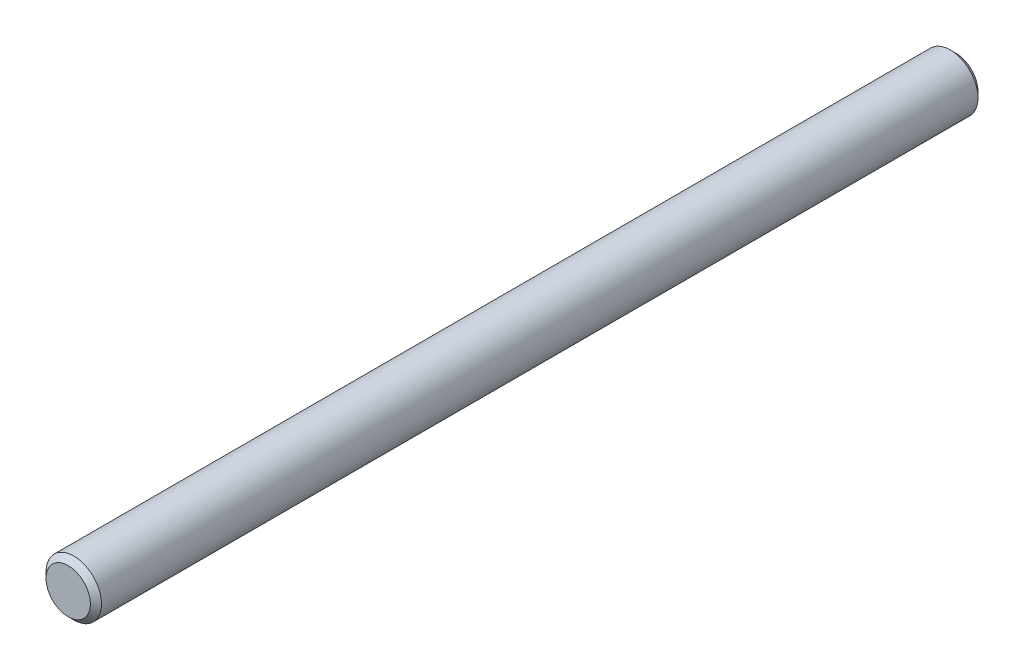
ISO-10303-21;
HEADER;
FILE_DESCRIPTION(('STEP AP214'),'2;1');
FILE_NAME('part.step','',(''),(''),'','','');
FILE_SCHEMA(('AUTOMOTIVE_DESIGN { 1 0 10303 214 1 1 1 1 }'));
ENDSEC;
DATA;
#1=APPLICATION_CONTEXT('core data for automotive mechanical design processes');
#2=APPLICATION_PROTOCOL_DEFINITION('international standard','automotive_design',2000,#1);
#3=PRODUCT_CONTEXT('',#1,'mechanical');
#4=PRODUCT('Part','Part','',(#3));
#5=PRODUCT_RELATED_PRODUCT_CATEGORY('part','',(#4));
#6=PRODUCT_DEFINITION_FORMATION('','',#4);
#7=PRODUCT_DEFINITION_CONTEXT('part definition',#1,'design');
#8=PRODUCT_DEFINITION('design','',#6,#7);
#9=PRODUCT_DEFINITION_SHAPE('','',#8);
#10=(LENGTH_UNIT() NAMED_UNIT(*) SI_UNIT(.MILLI.,.METRE.));
#11=(NAMED_UNIT(*) PLANE_ANGLE_UNIT() SI_UNIT($,.RADIAN.));
#12=(NAMED_UNIT(*) SI_UNIT($,.STERADIAN.) SOLID_ANGLE_UNIT());
#13=UNCERTAINTY_MEASURE_WITH_UNIT(LENGTH_MEASURE(1.E-05),#10,'distance_accuracy_value','');
#14=(GEOMETRIC_REPRESENTATION_CONTEXT(3) GLOBAL_UNCERTAINTY_ASSIGNED_CONTEXT((#13)) GLOBAL_UNIT_ASSIGNED_CONTEXT((#10,
#11,#12)) REPRESENTATION_CONTEXT('',''));
#15=CARTESIAN_POINT('',(0.,0.,0.));
#16=DIRECTION('',(0.,0.,1.));
#17=DIRECTION('',(1.,0.,0.));
#18=AXIS2_PLACEMENT_3D('',#15,#16,#17);
#19=CARTESIAN_POINT('',(0.,0.,-19.5000000000095));
#20=DIRECTION('',(0.,0.,1.));
#21=DIRECTION('',(1.,0.,0.));
#22=AXIS2_PLACEMENT_3D('',#19,#20,#21);
#23=CONICAL_SURFACE('',#22,2.5000000000273,0.785398163397448);
#24=CARTESIAN_POINT('',(0.,0.,-20.));
#25=DIRECTION('',(0.,0.,1.));
#26=DIRECTION('',(1.,0.,0.));
#27=AXIS2_PLACEMENT_3D('',#24,#25,#26);
#28=CIRCLE('',#27,2.00000000003684);
#29=CARTESIAN_POINT('',(2.00000000003683,0.,-20.));
#30=VERTEX_POINT('',#29);
#31=EDGE_CURVE('E52',#30,#30,#28,.T.);
#32=ORIENTED_EDGE('',*,*,#31,.T.);
#33=EDGE_LOOP('',(#32));
#34=FACE_BOUND('',#33,.T.);
#35=CARTESIAN_POINT('',(0.,0.,-19.5000000000095));
#36=DIRECTION('',(0.,0.,1.));
#37=DIRECTION('',(1.,0.,0.));
#38=AXIS2_PLACEMENT_3D('',#35,#36,#37);
#39=CIRCLE('',#38,2.5000000000273);
#40=CARTESIAN_POINT('',(2.50000000002729,0.,-19.5000000000095));
#41=VERTEX_POINT('',#40);
#42=EDGE_CURVE('E10',#41,#41,#39,.T.);
#43=ORIENTED_EDGE('',*,*,#42,.F.);
#44=EDGE_LOOP('',(#43));
#45=FACE_BOUND('',#44,.T.);
#46=ADVANCED_FACE('F34',(#34,#45),#23,.T.);
#47=CARTESIAN_POINT('',(0.,0.,-20.));
#48=DIRECTION('',(0.,0.,1.));
#49=DIRECTION('',(1.,0.,0.));
#50=AXIS2_PLACEMENT_3D('',#47,#48,#49);
#51=CYLINDRICAL_SURFACE('',#50,2.50000000002729);
#52=ORIENTED_EDGE('',*,*,#42,.T.);
#53=EDGE_LOOP('',(#52));
#54=FACE_BOUND('',#53,.T.);
#55=CARTESIAN_POINT('',(0.,0.,59.5000000000391));
#56=DIRECTION('',(0.,0.,1.));
#57=DIRECTION('',(1.,0.,0.));
#58=AXIS2_PLACEMENT_3D('',#55,#56,#57);
#59=CIRCLE('',#58,2.50000000002729);
#60=CARTESIAN_POINT('',(2.50000000002729,0.,59.5000000000391));
#61=VERTEX_POINT('',#60);
#62=EDGE_CURVE('E41',#61,#61,#59,.T.);
#63=ORIENTED_EDGE('',*,*,#62,.F.);
#64=EDGE_LOOP('',(#63));
#65=FACE_BOUND('',#64,.T.);
#66=ADVANCED_FACE('F71',(#54,#65),#51,.T.);
#67=CARTESIAN_POINT('',(0.,0.,60.));
#68=DIRECTION('',(0.,0.,-1.));
#69=DIRECTION('',(-1.,0.,0.));
#70=AXIS2_PLACEMENT_3D('',#67,#68,#69);
#71=CONICAL_SURFACE('',#70,2.00000000006639,0.78539816339745);
#72=ORIENTED_EDGE('',*,*,#62,.T.);
#73=EDGE_LOOP('',(#72));
#74=FACE_BOUND('',#73,.T.);
#75=CARTESIAN_POINT('',(0.,0.,60.));
#76=DIRECTION('',(0.,0.,1.));
#77=DIRECTION('',(1.,0.,0.));
#78=AXIS2_PLACEMENT_3D('',#75,#76,#77);
#79=CIRCLE('',#78,2.00000000006639);
#80=CARTESIAN_POINT('',(2.00000000006639,0.,60.));
#81=VERTEX_POINT('',#80);
#82=EDGE_CURVE('E48',#81,#81,#79,.T.);
#83=ORIENTED_EDGE('',*,*,#82,.F.);
#84=EDGE_LOOP('',(#83));
#85=FACE_BOUND('',#84,.T.);
#86=ADVANCED_FACE('F67',(#74,#85),#71,.T.);
#87=CARTESIAN_POINT('',(0.,0.,60.));
#88=DIRECTION('',(0.,0.,1.));
#89=DIRECTION('',(1.,0.,0.));
#90=AXIS2_PLACEMENT_3D('',#87,#88,#89);
#91=PLANE('',#90);
#92=ORIENTED_EDGE('',*,*,#82,.T.);
#93=EDGE_LOOP('',(#92));
#94=FACE_BOUND('',#93,.T.);
#95=ADVANCED_FACE('F62',(#94),#91,.T.);
#96=CARTESIAN_POINT('',(2.00000000003683,0.,-20.));
#97=DIRECTION('',(0.,0.,-1.));
#98=DIRECTION('',(-1.,0.,0.));
#99=AXIS2_PLACEMENT_3D('',#96,#97,#98);
#100=PLANE('',#99);
#101=ORIENTED_EDGE('',*,*,#31,.F.);
#102=EDGE_LOOP('',(#101));
#103=FACE_BOUND('',#102,.T.);
#104=ADVANCED_FACE('F60',(#103),#100,.T.);
#105=CLOSED_SHELL('',(#46,#66,#86,#95,#104));
#106=MANIFOLD_SOLID_BREP('B2',#105);
#107=ADVANCED_BREP_SHAPE_REPRESENTATION('',(#18,#106),#14);
#108=SHAPE_DEFINITION_REPRESENTATION(#9,#107);
ENDSEC;
END-ISO-10303-21;
